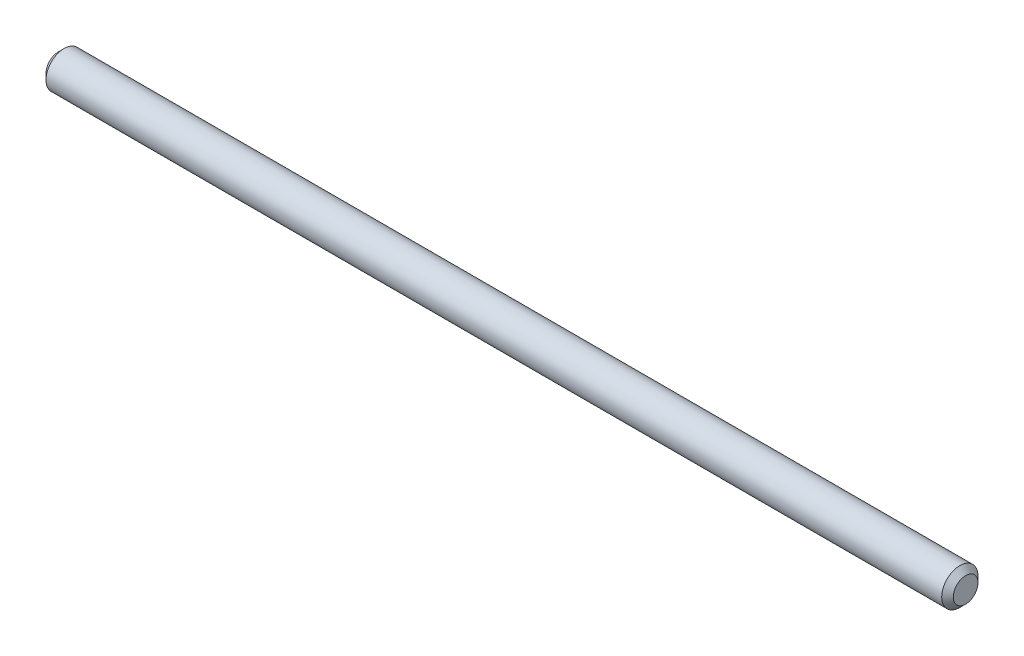
ISO-10303-21;
HEADER;
FILE_DESCRIPTION(('STEP AP214'),'2;1');
FILE_NAME('part.step','',(''),(''),'','','');
FILE_SCHEMA(('AUTOMOTIVE_DESIGN { 1 0 10303 214 1 1 1 1 }'));
ENDSEC;
DATA;
#1=APPLICATION_CONTEXT('core data for automotive mechanical design processes');
#2=APPLICATION_PROTOCOL_DEFINITION('international standard','automotive_design',2000,#1);
#3=PRODUCT_CONTEXT('',#1,'mechanical');
#4=PRODUCT('Part','Part','',(#3));
#5=PRODUCT_RELATED_PRODUCT_CATEGORY('part','',(#4));
#6=PRODUCT_DEFINITION_FORMATION('','',#4);
#7=PRODUCT_DEFINITION_CONTEXT('part definition',#1,'design');
#8=PRODUCT_DEFINITION('design','',#6,#7);
#9=PRODUCT_DEFINITION_SHAPE('','',#8);
#10=(LENGTH_UNIT() NAMED_UNIT(*) SI_UNIT(.MILLI.,.METRE.));
#11=(NAMED_UNIT(*) PLANE_ANGLE_UNIT() SI_UNIT($,.RADIAN.));
#12=(NAMED_UNIT(*) SI_UNIT($,.STERADIAN.) SOLID_ANGLE_UNIT());
#13=UNCERTAINTY_MEASURE_WITH_UNIT(LENGTH_MEASURE(1.E-05),#10,'distance_accuracy_value','');
#14=(GEOMETRIC_REPRESENTATION_CONTEXT(3) GLOBAL_UNCERTAINTY_ASSIGNED_CONTEXT((#13)) GLOBAL_UNIT_ASSIGNED_CONTEXT((#10,
#11,#12)) REPRESENTATION_CONTEXT('',''));
#15=CARTESIAN_POINT('',(0.,0.,0.));
#16=DIRECTION('',(0.,0.,1.));
#17=DIRECTION('',(1.,0.,0.));
#18=AXIS2_PLACEMENT_3D('',#15,#16,#17);
#19=CARTESIAN_POINT('',(198.727207793862,0.,0.));
#20=DIRECTION('',(-1.,0.,0.));
#21=DIRECTION('',(0.,0.,1.));
#22=AXIS2_PLACEMENT_3D('',#19,#20,#21);
#23=CONICAL_SURFACE('',#22,4.00000000000211,0.785398163397454);
#24=CARTESIAN_POINT('',(200.,0.,0.));
#25=DIRECTION('',(-1.,0.,0.));
#26=DIRECTION('',(0.,0.,1.));
#27=AXIS2_PLACEMENT_3D('',#24,#25,#26);
#28=CIRCLE('',#27,2.72720779386422);
#29=CARTESIAN_POINT('',(200.,0.,2.72720779386422));
#30=VERTEX_POINT('',#29);
#31=EDGE_CURVE('E51',#30,#30,#28,.T.);
#32=ORIENTED_EDGE('',*,*,#31,.T.);
#33=EDGE_LOOP('',(#32));
#34=FACE_BOUND('',#33,.T.);
#35=CARTESIAN_POINT('',(198.727207793862,0.,0.));
#36=DIRECTION('',(-1.,0.,0.));
#37=DIRECTION('',(0.,0.,1.));
#38=AXIS2_PLACEMENT_3D('',#35,#36,#37);
#39=CIRCLE('',#38,4.00000000000211);
#40=CARTESIAN_POINT('',(198.727207793862,0.,4.00000000000211));
#41=VERTEX_POINT('',#40);
#42=EDGE_CURVE('E10',#41,#41,#39,.T.);
#43=ORIENTED_EDGE('',*,*,#42,.F.);
#44=EDGE_LOOP('',(#43));
#45=FACE_BOUND('',#44,.T.);
#46=ADVANCED_FACE('F37',(#34,#45),#23,.T.);
#47=CARTESIAN_POINT('',(200.,0.,0.));
#48=DIRECTION('',(-1.,0.,0.));
#49=DIRECTION('',(0.,0.,1.));
#50=AXIS2_PLACEMENT_3D('',#47,#48,#49);
#51=CYLINDRICAL_SURFACE('',#50,4.00000000000213);
#52=ORIENTED_EDGE('',*,*,#42,.T.);
#53=EDGE_LOOP('',(#52));
#54=FACE_BOUND('',#53,.T.);
#55=CARTESIAN_POINT('',(1.27279220613791,0.,0.));
#56=DIRECTION('',(-1.,0.,0.));
#57=DIRECTION('',(0.,0.,1.));
#58=AXIS2_PLACEMENT_3D('',#55,#56,#57);
#59=CIRCLE('',#58,4.00000000000214);
#60=CARTESIAN_POINT('',(1.27279220613791,0.,4.00000000000214));
#61=VERTEX_POINT('',#60);
#62=EDGE_CURVE('E43',#61,#61,#59,.T.);
#63=ORIENTED_EDGE('',*,*,#62,.F.);
#64=EDGE_LOOP('',(#63));
#65=FACE_BOUND('',#64,.T.);
#66=ADVANCED_FACE('F70',(#54,#65),#51,.T.);
#67=CARTESIAN_POINT('',(2.1094237467878E-12,0.,0.));
#68=DIRECTION('',(1.,0.,0.));
#69=DIRECTION('',(0.,0.,-1.));
#70=AXIS2_PLACEMENT_3D('',#67,#68,#69);
#71=CONICAL_SURFACE('',#70,2.72720779386634,0.785398163397447);
#72=ORIENTED_EDGE('',*,*,#62,.T.);
#73=EDGE_LOOP('',(#72));
#74=FACE_BOUND('',#73,.T.);
#75=CARTESIAN_POINT('',(2.1094237467878E-12,0.,0.));
#76=DIRECTION('',(-1.,0.,0.));
#77=DIRECTION('',(0.,0.,1.));
#78=AXIS2_PLACEMENT_3D('',#75,#76,#77);
#79=CIRCLE('',#78,2.72720779386634);
#80=CARTESIAN_POINT('',(2.1094237467878E-12,0.,2.72720779386634));
#81=VERTEX_POINT('',#80);
#82=EDGE_CURVE('E47',#81,#81,#79,.T.);
#83=ORIENTED_EDGE('',*,*,#82,.F.);
#84=EDGE_LOOP('',(#83));
#85=FACE_BOUND('',#84,.T.);
#86=ADVANCED_FACE('F66',(#74,#85),#71,.T.);
#87=CARTESIAN_POINT('',(1.0590828238644E-12,0.,0.));
#88=DIRECTION('',(-1.,0.,0.));
#89=DIRECTION('',(0.,0.,1.));
#90=AXIS2_PLACEMENT_3D('',#87,#88,#89);
#91=PLANE('',#90);
#92=ORIENTED_EDGE('',*,*,#82,.T.);
#93=EDGE_LOOP('',(#92));
#94=FACE_BOUND('',#93,.T.);
#95=ADVANCED_FACE('F61',(#94),#91,.T.);
#96=CARTESIAN_POINT('',(200.,2.72720779386422,0.));
#97=DIRECTION('',(1.,0.,0.));
#98=DIRECTION('',(0.,0.,-1.));
#99=AXIS2_PLACEMENT_3D('',#96,#97,#98);
#100=PLANE('',#99);
#101=ORIENTED_EDGE('',*,*,#31,.F.);
#102=EDGE_LOOP('',(#101));
#103=FACE_BOUND('',#102,.T.);
#104=ADVANCED_FACE('F59',(#103),#100,.T.);
#105=CLOSED_SHELL('',(#46,#66,#86,#95,#104));
#106=MANIFOLD_SOLID_BREP('B2',#105);
#107=ADVANCED_BREP_SHAPE_REPRESENTATION('',(#18,#106),#14);
#108=SHAPE_DEFINITION_REPRESENTATION(#9,#107);
ENDSEC;
END-ISO-10303-21;
